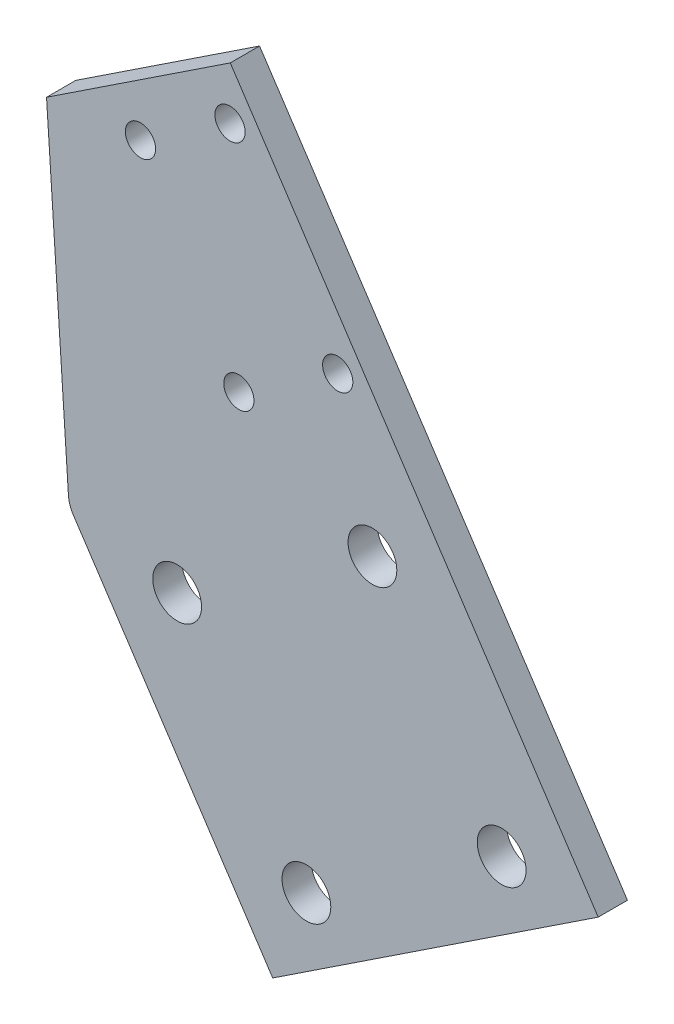
ISO-10303-21;
HEADER;
FILE_DESCRIPTION(('STEP AP214'),'2;1');
FILE_NAME('part.step','',(''),(''),'','','');
FILE_SCHEMA(('AUTOMOTIVE_DESIGN { 1 0 10303 214 1 1 1 1 }'));
ENDSEC;
DATA;
#1=APPLICATION_CONTEXT('core data for automotive mechanical design processes');
#2=APPLICATION_PROTOCOL_DEFINITION('international standard','automotive_design',2000,#1);
#3=PRODUCT_CONTEXT('',#1,'mechanical');
#4=PRODUCT('Part','Part','',(#3));
#5=PRODUCT_RELATED_PRODUCT_CATEGORY('part','',(#4));
#6=PRODUCT_DEFINITION_FORMATION('','',#4);
#7=PRODUCT_DEFINITION_CONTEXT('part definition',#1,'design');
#8=PRODUCT_DEFINITION('design','',#6,#7);
#9=PRODUCT_DEFINITION_SHAPE('','',#8);
#10=(LENGTH_UNIT() NAMED_UNIT(*) SI_UNIT(.MILLI.,.METRE.));
#11=(NAMED_UNIT(*) PLANE_ANGLE_UNIT() SI_UNIT($,.RADIAN.));
#12=(NAMED_UNIT(*) SI_UNIT($,.STERADIAN.) SOLID_ANGLE_UNIT());
#13=UNCERTAINTY_MEASURE_WITH_UNIT(LENGTH_MEASURE(1.E-05),#10,'distance_accuracy_value','');
#14=(GEOMETRIC_REPRESENTATION_CONTEXT(3) GLOBAL_UNCERTAINTY_ASSIGNED_CONTEXT((#13)) GLOBAL_UNIT_ASSIGNED_CONTEXT((#10,
#11,#12)) REPRESENTATION_CONTEXT('',''));
#15=CARTESIAN_POINT('',(0.,0.,0.));
#16=DIRECTION('',(0.,0.,1.));
#17=DIRECTION('',(1.,0.,0.));
#18=AXIS2_PLACEMENT_3D('',#15,#16,#17);
#19=CARTESIAN_POINT('',(5.33090820841948,-50.6602769426254,3.));
#20=DIRECTION('',(0.,0.,1.));
#21=DIRECTION('',(1.,0.,0.));
#22=AXIS2_PLACEMENT_3D('',#19,#20,#21);
#23=PLANE('',#22);
#24=DIRECTION('',(-0.833885822066983,-0.551936985312337,0.));
#25=VECTOR('',#24,1.);
#26=CARTESIAN_POINT('',(-13.2689465289371,-27.9943649075627,3.));
#27=LINE('',#26,#25);
#28=CARTESIAN_POINT('',(20.0864863537422,-5.91688549506922,3.));
#29=VERTEX_POINT('',#28);
#30=CARTESIAN_POINT('',(-13.2689465289371,-27.9943649075627,3.));
#31=VERTEX_POINT('',#30);
#32=EDGE_CURVE('E56',#29,#31,#27,.T.);
#33=ORIENTED_EDGE('',*,*,#32,.F.);
#34=DIRECTION('',(-0.551936985312337,0.833885822066984,0.));
#35=VECTOR('',#34,1.);
#36=CARTESIAN_POINT('',(36.1846836248979,-30.2386084860689,3.));
#37=LINE('',#36,#35);
#38=CARTESIAN_POINT('',(-17.6185043311538,51.0491414065522,3.));
#39=VERTEX_POINT('',#38);
#40=EDGE_CURVE('E104',#29,#39,#37,.T.);
#41=ORIENTED_EDGE('',*,*,#40,.T.);
#42=DIRECTION('',(0.833885822066983,0.551936985312337,0.));
#43=VECTOR('',#42,1.);
#44=CARTESIAN_POINT('',(-17.6185043311538,51.0491414065522,3.));
#45=LINE('',#44,#43);
#46=CARTESIAN_POINT('',(-36.4497087486141,38.5850391027016,3.));
#47=VERTEX_POINT('',#46);
#48=EDGE_CURVE('E152',#47,#39,#45,.T.);
#49=ORIENTED_EDGE('',*,*,#48,.F.);
#50=DIRECTION('',(0.0654922759111553,-0.99785307625721,0.));
#51=VECTOR('',#50,1.);
#52=CARTESIAN_POINT('',(-36.6765853874685,42.0417757767926,3.));
#53=LINE('',#52,#51);
#54=CARTESIAN_POINT('',(-34.2027045318633,4.3492450513638,3.));
#55=VERTEX_POINT('',#54);
#56=EDGE_CURVE('E111',#47,#55,#53,.T.);
#57=ORIENTED_EDGE('',*,*,#56,.T.);
#58=CARTESIAN_POINT('',(-31.2091453030917,4.5457218790973,3.));
#59=DIRECTION('',(0.,0.,1.));
#60=DIRECTION('',(1.,0.,0.));
#61=AXIS2_PLACEMENT_3D('',#58,#59,#60);
#62=CIRCLE('',#61,3.00000000000001);
#63=CARTESIAN_POINT('',(-33.7108027692926,2.88991092316026,3.));
#64=VERTEX_POINT('',#63);
#65=EDGE_CURVE('E114',#55,#64,#62,.T.);
#66=ORIENTED_EDGE('',*,*,#65,.T.);
#67=DIRECTION('',(0.551936985312337,-0.833885822066983,0.));
#68=VECTOR('',#67,1.);
#69=CARTESIAN_POINT('',(-33.7108027692926,2.88991092316027,3.));
#70=LINE('',#69,#68);
#71=EDGE_CURVE('E107',#64,#31,#70,.T.);
#72=ORIENTED_EDGE('',*,*,#71,.T.);
#73=EDGE_LOOP('',(#33,#41,#49,#57,#66,#72));
#74=FACE_BOUND('',#73,.T.);
#75=CARTESIAN_POINT('',(-17.6471134753504,45.6569620102235,3.));
#76=DIRECTION('',(0.,0.,1.));
#77=DIRECTION('',(1.,0.,0.));
#78=AXIS2_PLACEMENT_3D('',#75,#76,#77);
#79=CIRCLE('',#78,1.54999999999999);
#80=CARTESIAN_POINT('',(-16.0971134753504,45.6569620102235,3.));
#81=VERTEX_POINT('',#80);
#82=EDGE_CURVE('E165',#81,#81,#79,.T.);
#83=ORIENTED_EDGE('',*,*,#82,.F.);
#84=EDGE_LOOP('',(#83));
#85=FACE_BOUND('',#84,.T.);
#86=CARTESIAN_POINT('',(-6.60837376910368,28.9792455688839,3.));
#87=DIRECTION('',(0.,0.,1.));
#88=DIRECTION('',(1.,0.,0.));
#89=AXIS2_PLACEMENT_3D('',#86,#87,#88);
#90=CIRCLE('',#89,1.55000000000001);
#91=CARTESIAN_POINT('',(-5.05837376910367,28.9792455688839,3.));
#92=VERTEX_POINT('',#91);
#93=EDGE_CURVE('E177',#92,#92,#90,.T.);
#94=ORIENTED_EDGE('',*,*,#93,.F.);
#95=EDGE_LOOP('',(#94));
#96=FACE_BOUND('',#95,.T.);
#97=CARTESIAN_POINT('',(-23.0639448146735,1.2986714858883,3.));
#98=DIRECTION('',(0.,0.,1.));
#99=DIRECTION('',(1.,0.,0.));
#100=AXIS2_PLACEMENT_3D('',#97,#98,#99);
#101=CIRCLE('',#100,2.5);
#102=CARTESIAN_POINT('',(-20.5639448146735,1.2986714858883,3.));
#103=VERTEX_POINT('',#102);
#104=EDGE_CURVE('E189',#103,#103,#101,.T.);
#105=ORIENTED_EDGE('',*,*,#104,.F.);
#106=EDGE_LOOP('',(#105));
#107=FACE_BOUND('',#106,.T.);
#108=CARTESIAN_POINT('',(-9.8174571671774,-18.7145882437193,3.));
#109=DIRECTION('',(0.,0.,1.));
#110=DIRECTION('',(1.,0.,0.));
#111=AXIS2_PLACEMENT_3D('',#108,#109,#110);
#112=CIRCLE('',#111,2.5);
#113=CARTESIAN_POINT('',(-7.31745716717739,-18.7145882437193,3.));
#114=VERTEX_POINT('',#113);
#115=EDGE_CURVE('E129',#114,#114,#112,.T.);
#116=ORIENTED_EDGE('',*,*,#115,.F.);
#117=EDGE_LOOP('',(#116));
#118=FACE_BOUND('',#117,.T.);
#119=CARTESIAN_POINT('',(10.1958025624302,-5.46810059622321,3.));
#120=DIRECTION('',(0.,0.,1.));
#121=DIRECTION('',(1.,0.,0.));
#122=AXIS2_PLACEMENT_3D('',#119,#120,#121);
#123=CIRCLE('',#122,2.5);
#124=CARTESIAN_POINT('',(12.6958025624302,-5.46810059622321,3.));
#125=VERTEX_POINT('',#124);
#126=EDGE_CURVE('E195',#125,#125,#123,.T.);
#127=ORIENTED_EDGE('',*,*,#126,.F.);
#128=EDGE_LOOP('',(#127));
#129=FACE_BOUND('',#128,.T.);
#130=CARTESIAN_POINT('',(-3.05068508506588,14.5451591333844,3.));
#131=DIRECTION('',(0.,0.,1.));
#132=DIRECTION('',(1.,0.,0.));
#133=AXIS2_PLACEMENT_3D('',#130,#131,#132);
#134=CIRCLE('',#133,2.5);
#135=CARTESIAN_POINT('',(-0.550685085065878,14.5451591333844,3.));
#136=VERTEX_POINT('',#135);
#137=EDGE_CURVE('E183',#136,#136,#134,.T.);
#138=ORIENTED_EDGE('',*,*,#137,.F.);
#139=EDGE_LOOP('',(#138));
#140=FACE_BOUND('',#139,.T.);
#141=CARTESIAN_POINT('',(-16.7390657821432,22.2738868005276,3.));
#142=DIRECTION('',(0.,0.,1.));
#143=DIRECTION('',(1.,0.,0.));
#144=AXIS2_PLACEMENT_3D('',#141,#142,#143);
#145=CIRCLE('',#144,1.55000000000001);
#146=CARTESIAN_POINT('',(-15.1890657821432,22.2738868005276,3.));
#147=VERTEX_POINT('',#146);
#148=EDGE_CURVE('E171',#147,#147,#145,.T.);
#149=ORIENTED_EDGE('',*,*,#148,.F.);
#150=EDGE_LOOP('',(#149));
#151=FACE_BOUND('',#150,.T.);
#152=CARTESIAN_POINT('',(-26.8198575180872,39.5856551717878,3.));
#153=DIRECTION('',(0.,0.,1.));
#154=DIRECTION('',(1.,0.,0.));
#155=AXIS2_PLACEMENT_3D('',#152,#153,#154);
#156=CIRCLE('',#155,1.54999999999999);
#157=CARTESIAN_POINT('',(-25.2698575180872,39.5856551717878,3.));
#158=VERTEX_POINT('',#157);
#159=EDGE_CURVE('E159',#158,#158,#156,.T.);
#160=ORIENTED_EDGE('',*,*,#159,.F.);
#161=EDGE_LOOP('',(#160));
#162=FACE_BOUND('',#161,.T.);
#163=ADVANCED_FACE('F41',(#74,#85,#96,#107,#118,#129,#140,#151,#162),#23,.T.);
#164=CARTESIAN_POINT('',(5.33090820841948,-50.6602769426254,0.));
#165=DIRECTION('',(0.,0.,1.));
#166=DIRECTION('',(1.,0.,0.));
#167=AXIS2_PLACEMENT_3D('',#164,#165,#166);
#168=PLANE('',#167);
#169=DIRECTION('',(-0.551936985312337,0.833885822066984,0.));
#170=VECTOR('',#169,1.);
#171=CARTESIAN_POINT('',(36.1846836248979,-30.2386084860689,0.));
#172=LINE('',#171,#170);
#173=CARTESIAN_POINT('',(20.0864863537422,-5.91688549506922,0.));
#174=VERTEX_POINT('',#173);
#175=CARTESIAN_POINT('',(-17.6185043311538,51.0491414065522,0.));
#176=VERTEX_POINT('',#175);
#177=EDGE_CURVE('E126',#174,#176,#172,.T.);
#178=ORIENTED_EDGE('',*,*,#177,.F.);
#179=DIRECTION('',(-0.833885822066983,-0.551936985312337,0.));
#180=VECTOR('',#179,1.);
#181=CARTESIAN_POINT('',(-10.7672890627362,-26.3385539516257,0.));
#182=LINE('',#181,#180);
#183=CARTESIAN_POINT('',(-13.2689465289371,-27.9943649075627,0.));
#184=VERTEX_POINT('',#183);
#185=EDGE_CURVE('E95',#174,#184,#182,.T.);
#186=ORIENTED_EDGE('',*,*,#185,.T.);
#187=DIRECTION('',(0.551936985312337,-0.833885822066983,0.));
#188=VECTOR('',#187,1.);
#189=CARTESIAN_POINT('',(-33.7108027692926,2.88991092316027,0.));
#190=LINE('',#189,#188);
#191=CARTESIAN_POINT('',(-33.7108027692926,2.88991092316026,0.));
#192=VERTEX_POINT('',#191);
#193=EDGE_CURVE('E112',#192,#184,#190,.T.);
#194=ORIENTED_EDGE('',*,*,#193,.F.);
#195=CARTESIAN_POINT('',(-31.2091453030917,4.5457218790973,0.));
#196=DIRECTION('',(0.,0.,1.));
#197=DIRECTION('',(1.,0.,0.));
#198=AXIS2_PLACEMENT_3D('',#195,#196,#197);
#199=CIRCLE('',#198,3.00000000000001);
#200=CARTESIAN_POINT('',(-34.2027045318633,4.3492450513638,0.));
#201=VERTEX_POINT('',#200);
#202=EDGE_CURVE('E117',#201,#192,#199,.T.);
#203=ORIENTED_EDGE('',*,*,#202,.F.);
#204=DIRECTION('',(0.0654922759111553,-0.99785307625721,0.));
#205=VECTOR('',#204,1.);
#206=CARTESIAN_POINT('',(-36.6765853874685,42.0417757767926,0.));
#207=LINE('',#206,#205);
#208=CARTESIAN_POINT('',(-36.4497087486141,38.5850391027016,0.));
#209=VERTEX_POINT('',#208);
#210=EDGE_CURVE('E128',#209,#201,#207,.T.);
#211=ORIENTED_EDGE('',*,*,#210,.F.);
#212=DIRECTION('',(0.833885822066984,0.551936985312337,0.));
#213=VECTOR('',#212,1.);
#214=CARTESIAN_POINT('',(-48.4722797476322,30.6274729499957,0.));
#215=LINE('',#214,#213);
#216=EDGE_CURVE('E63',#209,#176,#215,.T.);
#217=ORIENTED_EDGE('',*,*,#216,.T.);
#218=EDGE_LOOP('',(#178,#186,#194,#203,#211,#217));
#219=FACE_BOUND('',#218,.T.);
#220=CARTESIAN_POINT('',(-9.8174571671774,-18.7145882437193,0.));
#221=DIRECTION('',(0.,0.,1.));
#222=DIRECTION('',(1.,0.,0.));
#223=AXIS2_PLACEMENT_3D('',#220,#221,#222);
#224=CIRCLE('',#223,2.5);
#225=CARTESIAN_POINT('',(-7.31745716717739,-18.7145882437193,0.));
#226=VERTEX_POINT('',#225);
#227=EDGE_CURVE('E120',#226,#226,#224,.T.);
#228=ORIENTED_EDGE('',*,*,#227,.T.);
#229=EDGE_LOOP('',(#228));
#230=FACE_BOUND('',#229,.T.);
#231=CARTESIAN_POINT('',(10.1958025624302,-5.46810059622321,0.));
#232=DIRECTION('',(0.,0.,1.));
#233=DIRECTION('',(1.,0.,0.));
#234=AXIS2_PLACEMENT_3D('',#231,#232,#233);
#235=CIRCLE('',#234,2.5);
#236=CARTESIAN_POINT('',(12.6958025624302,-5.46810059622321,0.));
#237=VERTEX_POINT('',#236);
#238=EDGE_CURVE('E192',#237,#237,#235,.T.);
#239=ORIENTED_EDGE('',*,*,#238,.T.);
#240=EDGE_LOOP('',(#239));
#241=FACE_BOUND('',#240,.T.);
#242=CARTESIAN_POINT('',(-23.0639448146735,1.2986714858883,0.));
#243=DIRECTION('',(0.,0.,1.));
#244=DIRECTION('',(1.,0.,0.));
#245=AXIS2_PLACEMENT_3D('',#242,#243,#244);
#246=CIRCLE('',#245,2.5);
#247=CARTESIAN_POINT('',(-20.5639448146735,1.2986714858883,0.));
#248=VERTEX_POINT('',#247);
#249=EDGE_CURVE('E186',#248,#248,#246,.T.);
#250=ORIENTED_EDGE('',*,*,#249,.T.);
#251=EDGE_LOOP('',(#250));
#252=FACE_BOUND('',#251,.T.);
#253=CARTESIAN_POINT('',(-3.05068508506588,14.5451591333844,0.));
#254=DIRECTION('',(0.,0.,1.));
#255=DIRECTION('',(1.,0.,0.));
#256=AXIS2_PLACEMENT_3D('',#253,#254,#255);
#257=CIRCLE('',#256,2.5);
#258=CARTESIAN_POINT('',(-0.550685085065878,14.5451591333844,0.));
#259=VERTEX_POINT('',#258);
#260=EDGE_CURVE('E180',#259,#259,#257,.T.);
#261=ORIENTED_EDGE('',*,*,#260,.T.);
#262=EDGE_LOOP('',(#261));
#263=FACE_BOUND('',#262,.T.);
#264=CARTESIAN_POINT('',(-6.60837376910368,28.9792455688839,0.));
#265=DIRECTION('',(0.,0.,1.));
#266=DIRECTION('',(1.,0.,0.));
#267=AXIS2_PLACEMENT_3D('',#264,#265,#266);
#268=CIRCLE('',#267,1.55000000000001);
#269=CARTESIAN_POINT('',(-5.05837376910367,28.9792455688839,0.));
#270=VERTEX_POINT('',#269);
#271=EDGE_CURVE('E174',#270,#270,#268,.T.);
#272=ORIENTED_EDGE('',*,*,#271,.T.);
#273=EDGE_LOOP('',(#272));
#274=FACE_BOUND('',#273,.T.);
#275=CARTESIAN_POINT('',(-16.7390657821432,22.2738868005276,0.));
#276=DIRECTION('',(0.,0.,1.));
#277=DIRECTION('',(1.,0.,0.));
#278=AXIS2_PLACEMENT_3D('',#275,#276,#277);
#279=CIRCLE('',#278,1.55000000000001);
#280=CARTESIAN_POINT('',(-15.1890657821432,22.2738868005276,0.));
#281=VERTEX_POINT('',#280);
#282=EDGE_CURVE('E168',#281,#281,#279,.T.);
#283=ORIENTED_EDGE('',*,*,#282,.T.);
#284=EDGE_LOOP('',(#283));
#285=FACE_BOUND('',#284,.T.);
#286=CARTESIAN_POINT('',(-17.6471134753504,45.6569620102235,0.));
#287=DIRECTION('',(0.,0.,1.));
#288=DIRECTION('',(1.,0.,0.));
#289=AXIS2_PLACEMENT_3D('',#286,#287,#288);
#290=CIRCLE('',#289,1.54999999999999);
#291=CARTESIAN_POINT('',(-16.0971134753504,45.6569620102235,0.));
#292=VERTEX_POINT('',#291);
#293=EDGE_CURVE('E162',#292,#292,#290,.T.);
#294=ORIENTED_EDGE('',*,*,#293,.T.);
#295=EDGE_LOOP('',(#294));
#296=FACE_BOUND('',#295,.T.);
#297=CARTESIAN_POINT('',(-26.8198575180872,39.5856551717878,0.));
#298=DIRECTION('',(0.,0.,1.));
#299=DIRECTION('',(1.,0.,0.));
#300=AXIS2_PLACEMENT_3D('',#297,#298,#299);
#301=CIRCLE('',#300,1.54999999999999);
#302=CARTESIAN_POINT('',(-25.2698575180872,39.5856551717878,0.));
#303=VERTEX_POINT('',#302);
#304=EDGE_CURVE('E158',#303,#303,#301,.T.);
#305=ORIENTED_EDGE('',*,*,#304,.T.);
#306=EDGE_LOOP('',(#305));
#307=FACE_BOUND('',#306,.T.);
#308=ADVANCED_FACE('F143',(#219,#230,#241,#252,#263,#274,#285,#296,#307),#168,.F.);
#309=CARTESIAN_POINT('',(36.1846836248979,-30.2386084860689,3.));
#310=DIRECTION('',(-0.833885822066983,-0.551936985312337,0.));
#311=DIRECTION('',(0.551936985312337,-0.833885822066984,0.));
#312=AXIS2_PLACEMENT_3D('',#309,#310,#311);
#313=PLANE('',#312);
#314=ORIENTED_EDGE('',*,*,#40,.F.);
#315=DIRECTION('',(0.,0.,1.));
#316=VECTOR('',#315,1.);
#317=CARTESIAN_POINT('',(20.0864863537422,-5.91688549506922,-7.));
#318=LINE('',#317,#316);
#319=EDGE_CURVE('E92',#174,#29,#318,.T.);
#320=ORIENTED_EDGE('',*,*,#319,.F.);
#321=ORIENTED_EDGE('',*,*,#177,.T.);
#322=DIRECTION('',(0.,0.,1.));
#323=VECTOR('',#322,1.);
#324=CARTESIAN_POINT('',(-17.6185043311538,51.0491414065522,-7.));
#325=LINE('',#324,#323);
#326=EDGE_CURVE('E110',#176,#39,#325,.T.);
#327=ORIENTED_EDGE('',*,*,#326,.T.);
#328=EDGE_LOOP('',(#314,#320,#321,#327));
#329=FACE_BOUND('',#328,.T.);
#330=ADVANCED_FACE('F43',(#329),#313,.F.);
#331=CARTESIAN_POINT('',(-36.6765853874685,42.0417757767926,3.));
#332=DIRECTION('',(0.99785307625721,0.0654922759111553,0.));
#333=DIRECTION('',(-0.0654922759111553,0.99785307625721,0.));
#334=AXIS2_PLACEMENT_3D('',#331,#332,#333);
#335=PLANE('',#334);
#336=ORIENTED_EDGE('',*,*,#56,.F.);
#337=DIRECTION('',(0.,0.,-1.));
#338=VECTOR('',#337,1.);
#339=CARTESIAN_POINT('',(-36.4497087486141,38.5850391027016,3.));
#340=LINE('',#339,#338);
#341=EDGE_CURVE('E49',#47,#209,#340,.T.);
#342=ORIENTED_EDGE('',*,*,#341,.T.);
#343=ORIENTED_EDGE('',*,*,#210,.T.);
#344=DIRECTION('',(0.,0.,-1.));
#345=VECTOR('',#344,1.);
#346=CARTESIAN_POINT('',(-34.2027045318633,4.3492450513638,3.));
#347=LINE('',#346,#345);
#348=EDGE_CURVE('E134',#55,#201,#347,.T.);
#349=ORIENTED_EDGE('',*,*,#348,.F.);
#350=EDGE_LOOP('',(#336,#342,#343,#349));
#351=FACE_BOUND('',#350,.T.);
#352=ADVANCED_FACE('F139',(#351),#335,.F.);
#353=CARTESIAN_POINT('',(-31.2091453030917,4.5457218790973,3.));
#354=DIRECTION('',(0.,0.,-1.));
#355=DIRECTION('',(-1.,0.,0.));
#356=AXIS2_PLACEMENT_3D('',#353,#354,#355);
#357=CYLINDRICAL_SURFACE('',#356,3.00000000000001);
#358=ORIENTED_EDGE('',*,*,#202,.T.);
#359=DIRECTION('',(0.,0.,-1.));
#360=VECTOR('',#359,1.);
#361=CARTESIAN_POINT('',(-33.7108027692926,2.88991092316026,3.));
#362=LINE('',#361,#360);
#363=EDGE_CURVE('E125',#64,#192,#362,.T.);
#364=ORIENTED_EDGE('',*,*,#363,.F.);
#365=ORIENTED_EDGE('',*,*,#65,.F.);
#366=ORIENTED_EDGE('',*,*,#348,.T.);
#367=EDGE_LOOP('',(#358,#364,#365,#366));
#368=FACE_BOUND('',#367,.T.);
#369=ADVANCED_FACE('F148',(#368),#357,.T.);
#370=CARTESIAN_POINT('',(-33.7108027692926,2.88991092316027,3.));
#371=DIRECTION('',(0.833885822066983,0.551936985312337,0.));
#372=DIRECTION('',(-0.551936985312337,0.833885822066983,0.));
#373=AXIS2_PLACEMENT_3D('',#370,#371,#372);
#374=PLANE('',#373);
#375=ORIENTED_EDGE('',*,*,#193,.T.);
#376=DIRECTION('',(0.,0.,1.));
#377=VECTOR('',#376,1.);
#378=CARTESIAN_POINT('',(-13.2689465289371,-27.9943649075627,3.));
#379=LINE('',#378,#377);
#380=EDGE_CURVE('E11',#184,#31,#379,.T.);
#381=ORIENTED_EDGE('',*,*,#380,.T.);
#382=ORIENTED_EDGE('',*,*,#71,.F.);
#383=ORIENTED_EDGE('',*,*,#363,.T.);
#384=EDGE_LOOP('',(#375,#381,#382,#383));
#385=FACE_BOUND('',#384,.T.);
#386=ADVANCED_FACE('F151',(#385),#374,.F.);
#387=CARTESIAN_POINT('',(-9.8174571671774,-18.7145882437193,3.));
#388=DIRECTION('',(0.,0.,-1.));
#389=DIRECTION('',(-1.,0.,0.));
#390=AXIS2_PLACEMENT_3D('',#387,#388,#389);
#391=CYLINDRICAL_SURFACE('',#390,2.5);
#392=ORIENTED_EDGE('',*,*,#227,.F.);
#393=EDGE_LOOP('',(#392));
#394=FACE_BOUND('',#393,.T.);
#395=ORIENTED_EDGE('',*,*,#115,.T.);
#396=EDGE_LOOP('',(#395));
#397=FACE_BOUND('',#396,.T.);
#398=ADVANCED_FACE('F206',(#394,#397),#391,.F.);
#399=CARTESIAN_POINT('',(10.1958025624302,-5.46810059622321,3.));
#400=DIRECTION('',(0.,0.,-1.));
#401=DIRECTION('',(-1.,0.,0.));
#402=AXIS2_PLACEMENT_3D('',#399,#400,#401);
#403=CYLINDRICAL_SURFACE('',#402,2.5);
#404=ORIENTED_EDGE('',*,*,#238,.F.);
#405=EDGE_LOOP('',(#404));
#406=FACE_BOUND('',#405,.T.);
#407=ORIENTED_EDGE('',*,*,#126,.T.);
#408=EDGE_LOOP('',(#407));
#409=FACE_BOUND('',#408,.T.);
#410=ADVANCED_FACE('F208',(#406,#409),#403,.F.);
#411=CARTESIAN_POINT('',(-23.0639448146735,1.2986714858883,3.));
#412=DIRECTION('',(0.,0.,-1.));
#413=DIRECTION('',(-1.,0.,0.));
#414=AXIS2_PLACEMENT_3D('',#411,#412,#413);
#415=CYLINDRICAL_SURFACE('',#414,2.5);
#416=ORIENTED_EDGE('',*,*,#249,.F.);
#417=EDGE_LOOP('',(#416));
#418=FACE_BOUND('',#417,.T.);
#419=ORIENTED_EDGE('',*,*,#104,.T.);
#420=EDGE_LOOP('',(#419));
#421=FACE_BOUND('',#420,.T.);
#422=ADVANCED_FACE('F214',(#418,#421),#415,.F.);
#423=CARTESIAN_POINT('',(-3.05068508506588,14.5451591333844,3.));
#424=DIRECTION('',(0.,0.,-1.));
#425=DIRECTION('',(-1.,0.,0.));
#426=AXIS2_PLACEMENT_3D('',#423,#424,#425);
#427=CYLINDRICAL_SURFACE('',#426,2.5);
#428=ORIENTED_EDGE('',*,*,#260,.F.);
#429=EDGE_LOOP('',(#428));
#430=FACE_BOUND('',#429,.T.);
#431=ORIENTED_EDGE('',*,*,#137,.T.);
#432=EDGE_LOOP('',(#431));
#433=FACE_BOUND('',#432,.T.);
#434=ADVANCED_FACE('F296',(#430,#433),#427,.F.);
#435=CARTESIAN_POINT('',(-6.60837376910368,28.9792455688839,3.));
#436=DIRECTION('',(0.,0.,-1.));
#437=DIRECTION('',(-1.,0.,0.));
#438=AXIS2_PLACEMENT_3D('',#435,#436,#437);
#439=CYLINDRICAL_SURFACE('',#438,1.55000000000001);
#440=ORIENTED_EDGE('',*,*,#271,.F.);
#441=EDGE_LOOP('',(#440));
#442=FACE_BOUND('',#441,.T.);
#443=ORIENTED_EDGE('',*,*,#93,.T.);
#444=EDGE_LOOP('',(#443));
#445=FACE_BOUND('',#444,.T.);
#446=ADVANCED_FACE('F287',(#442,#445),#439,.F.);
#447=CARTESIAN_POINT('',(-16.7390657821432,22.2738868005276,3.));
#448=DIRECTION('',(0.,0.,-1.));
#449=DIRECTION('',(-1.,0.,0.));
#450=AXIS2_PLACEMENT_3D('',#447,#448,#449);
#451=CYLINDRICAL_SURFACE('',#450,1.55000000000001);
#452=ORIENTED_EDGE('',*,*,#282,.F.);
#453=EDGE_LOOP('',(#452));
#454=FACE_BOUND('',#453,.T.);
#455=ORIENTED_EDGE('',*,*,#148,.T.);
#456=EDGE_LOOP('',(#455));
#457=FACE_BOUND('',#456,.T.);
#458=ADVANCED_FACE('F278',(#454,#457),#451,.F.);
#459=CARTESIAN_POINT('',(-17.6471134753504,45.6569620102235,3.));
#460=DIRECTION('',(0.,0.,-1.));
#461=DIRECTION('',(-1.,0.,0.));
#462=AXIS2_PLACEMENT_3D('',#459,#460,#461);
#463=CYLINDRICAL_SURFACE('',#462,1.54999999999999);
#464=ORIENTED_EDGE('',*,*,#293,.F.);
#465=EDGE_LOOP('',(#464));
#466=FACE_BOUND('',#465,.T.);
#467=ORIENTED_EDGE('',*,*,#82,.T.);
#468=EDGE_LOOP('',(#467));
#469=FACE_BOUND('',#468,.T.);
#470=ADVANCED_FACE('F268',(#466,#469),#463,.F.);
#471=CARTESIAN_POINT('',(-26.8198575180872,39.5856551717878,3.));
#472=DIRECTION('',(0.,0.,-1.));
#473=DIRECTION('',(-1.,0.,0.));
#474=AXIS2_PLACEMENT_3D('',#471,#472,#473);
#475=CYLINDRICAL_SURFACE('',#474,1.54999999999999);
#476=ORIENTED_EDGE('',*,*,#304,.F.);
#477=EDGE_LOOP('',(#476));
#478=FACE_BOUND('',#477,.T.);
#479=ORIENTED_EDGE('',*,*,#159,.T.);
#480=EDGE_LOOP('',(#479));
#481=FACE_BOUND('',#480,.T.);
#482=ADVANCED_FACE('F260',(#478,#481),#475,.F.);
#483=CARTESIAN_POINT('',(-17.6185043311538,51.0491414065522,-7.));
#484=DIRECTION('',(0.551936985312337,-0.833885822066983,0.));
#485=DIRECTION('',(0.833885822066984,0.551936985312337,0.));
#486=AXIS2_PLACEMENT_3D('',#483,#484,#485);
#487=PLANE('',#486);
#488=ORIENTED_EDGE('',*,*,#341,.F.);
#489=ORIENTED_EDGE('',*,*,#48,.T.);
#490=ORIENTED_EDGE('',*,*,#326,.F.);
#491=ORIENTED_EDGE('',*,*,#216,.F.);
#492=EDGE_LOOP('',(#488,#489,#490,#491));
#493=FACE_BOUND('',#492,.T.);
#494=ADVANCED_FACE('F249',(#493),#487,.F.);
#495=CARTESIAN_POINT('',(-13.2689465289371,-27.9943649075627,-7.));
#496=DIRECTION('',(-0.551936985312337,0.833885822066983,0.));
#497=DIRECTION('',(-0.833885822066983,-0.551936985312337,0.));
#498=AXIS2_PLACEMENT_3D('',#495,#496,#497);
#499=PLANE('',#498);
#500=ORIENTED_EDGE('',*,*,#319,.T.);
#501=ORIENTED_EDGE('',*,*,#32,.T.);
#502=ORIENTED_EDGE('',*,*,#380,.F.);
#503=ORIENTED_EDGE('',*,*,#185,.F.);
#504=EDGE_LOOP('',(#500,#501,#502,#503));
#505=FACE_BOUND('',#504,.T.);
#506=ADVANCED_FACE('F93',(#505),#499,.F.);
#507=CLOSED_SHELL('',(#163,#308,#330,#352,#369,#386,#398,#410,#422,#434,#446,#458,#470,#482,
#494,#506));
#508=MANIFOLD_SOLID_BREP('B2',#507);
#509=ADVANCED_BREP_SHAPE_REPRESENTATION('',(#18,#508),#14);
#510=SHAPE_DEFINITION_REPRESENTATION(#9,#509);
ENDSEC;
END-ISO-10303-21;
